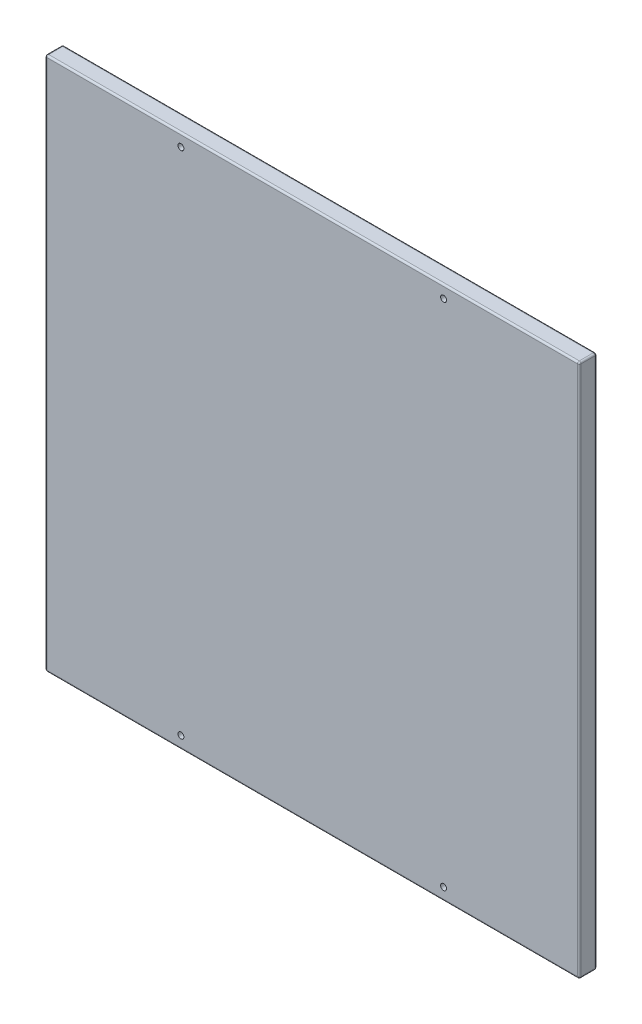
ISO-10303-21;
HEADER;
FILE_DESCRIPTION(('STEP AP214'),'2;1');
FILE_NAME('part.step','',(''),(''),'','','');
FILE_SCHEMA(('AUTOMOTIVE_DESIGN { 1 0 10303 214 1 1 1 1 }'));
ENDSEC;
DATA;
#1=APPLICATION_CONTEXT('core data for automotive mechanical design processes');
#2=APPLICATION_PROTOCOL_DEFINITION('international standard','automotive_design',2000,#1);
#3=PRODUCT_CONTEXT('',#1,'mechanical');
#4=PRODUCT('Part','Part','',(#3));
#5=PRODUCT_RELATED_PRODUCT_CATEGORY('part','',(#4));
#6=PRODUCT_DEFINITION_FORMATION('','',#4);
#7=PRODUCT_DEFINITION_CONTEXT('part definition',#1,'design');
#8=PRODUCT_DEFINITION('design','',#6,#7);
#9=PRODUCT_DEFINITION_SHAPE('','',#8);
#10=(LENGTH_UNIT() NAMED_UNIT(*) SI_UNIT(.MILLI.,.METRE.));
#11=(NAMED_UNIT(*) PLANE_ANGLE_UNIT() SI_UNIT($,.RADIAN.));
#12=(NAMED_UNIT(*) SI_UNIT($,.STERADIAN.) SOLID_ANGLE_UNIT());
#13=UNCERTAINTY_MEASURE_WITH_UNIT(LENGTH_MEASURE(1.E-05),#10,'distance_accuracy_value','');
#14=(GEOMETRIC_REPRESENTATION_CONTEXT(3) GLOBAL_UNCERTAINTY_ASSIGNED_CONTEXT((#13)) GLOBAL_UNIT_ASSIGNED_CONTEXT((#10,
#11,#12)) REPRESENTATION_CONTEXT('',''));
#15=CARTESIAN_POINT('',(0.,0.,0.));
#16=DIRECTION('',(0.,0.,1.));
#17=DIRECTION('',(1.,0.,0.));
#18=AXIS2_PLACEMENT_3D('',#15,#16,#17);
#19=CARTESIAN_POINT('',(152.5,-152.5,10.));
#20=DIRECTION('',(-1.,0.,0.));
#21=DIRECTION('',(0.,0.,1.));
#22=AXIS2_PLACEMENT_3D('',#19,#20,#21);
#23=PLANE('',#22);
#24=DIRECTION('',(0.,0.,-1.));
#25=VECTOR('',#24,1.);
#26=CARTESIAN_POINT('',(152.5,-151.5,10.));
#27=LINE('',#26,#25);
#28=CARTESIAN_POINT('',(152.5,-151.5,9.));
#29=VERTEX_POINT('',#28);
#30=CARTESIAN_POINT('',(152.5,-151.5,0.999999999999999));
#31=VERTEX_POINT('',#30);
#32=EDGE_CURVE('E187',#29,#31,#27,.T.);
#33=ORIENTED_EDGE('',*,*,#32,.T.);
#34=DIRECTION('',(0.,1.,0.));
#35=VECTOR('',#34,1.);
#36=CARTESIAN_POINT('',(152.5,152.5,0.999999999999999));
#37=LINE('',#36,#35);
#38=CARTESIAN_POINT('',(152.5,151.5,0.999999999999999));
#39=VERTEX_POINT('',#38);
#40=EDGE_CURVE('E190',#31,#39,#37,.T.);
#41=ORIENTED_EDGE('',*,*,#40,.T.);
#42=DIRECTION('',(0.,0.,-1.));
#43=VECTOR('',#42,1.);
#44=CARTESIAN_POINT('',(152.5,151.5,10.));
#45=LINE('',#44,#43);
#46=CARTESIAN_POINT('',(152.5,151.5,9.));
#47=VERTEX_POINT('',#46);
#48=EDGE_CURVE('E185',#39,#47,#45,.F.);
#49=ORIENTED_EDGE('',*,*,#48,.T.);
#50=DIRECTION('',(0.,1.,0.));
#51=VECTOR('',#50,1.);
#52=CARTESIAN_POINT('',(152.5,-152.5,9.));
#53=LINE('',#52,#51);
#54=EDGE_CURVE('E183',#47,#29,#53,.F.);
#55=ORIENTED_EDGE('',*,*,#54,.T.);
#56=EDGE_LOOP('',(#33,#41,#49,#55));
#57=FACE_BOUND('',#56,.T.);
#58=ADVANCED_FACE('F33',(#57),#23,.F.);
#59=CARTESIAN_POINT('',(-152.5,152.5,10.));
#60=DIRECTION('',(0.,-1.,0.));
#61=DIRECTION('',(0.,0.,-1.));
#62=AXIS2_PLACEMENT_3D('',#59,#60,#61);
#63=PLANE('',#62);
#64=DIRECTION('',(0.,0.,-1.));
#65=VECTOR('',#64,1.);
#66=CARTESIAN_POINT('',(151.5,152.5,10.));
#67=LINE('',#66,#65);
#68=CARTESIAN_POINT('',(151.5,152.5,9.));
#69=VERTEX_POINT('',#68);
#70=CARTESIAN_POINT('',(151.5,152.5,0.999999999999999));
#71=VERTEX_POINT('',#70);
#72=EDGE_CURVE('E169',#69,#71,#67,.T.);
#73=ORIENTED_EDGE('',*,*,#72,.T.);
#74=DIRECTION('',(-1.,0.,0.));
#75=VECTOR('',#74,1.);
#76=CARTESIAN_POINT('',(-152.5,152.5,0.999999999999999));
#77=LINE('',#76,#75);
#78=CARTESIAN_POINT('',(-151.5,152.5,0.999999999999999));
#79=VERTEX_POINT('',#78);
#80=EDGE_CURVE('E174',#71,#79,#77,.T.);
#81=ORIENTED_EDGE('',*,*,#80,.T.);
#82=DIRECTION('',(0.,0.,-1.));
#83=VECTOR('',#82,1.);
#84=CARTESIAN_POINT('',(-151.5,152.5,10.));
#85=LINE('',#84,#83);
#86=CARTESIAN_POINT('',(-151.5,152.5,9.));
#87=VERTEX_POINT('',#86);
#88=EDGE_CURVE('E171',#79,#87,#85,.F.);
#89=ORIENTED_EDGE('',*,*,#88,.T.);
#90=DIRECTION('',(-1.,0.,0.));
#91=VECTOR('',#90,1.);
#92=CARTESIAN_POINT('',(-152.5,152.5,9.));
#93=LINE('',#92,#91);
#94=EDGE_CURVE('E167',#87,#69,#93,.F.);
#95=ORIENTED_EDGE('',*,*,#94,.T.);
#96=EDGE_LOOP('',(#73,#81,#89,#95));
#97=FACE_BOUND('',#96,.T.);
#98=ADVANCED_FACE('F310',(#97),#63,.F.);
#99=CARTESIAN_POINT('',(-152.5,-152.5,10.));
#100=DIRECTION('',(1.,0.,0.));
#101=DIRECTION('',(0.,0.,-1.));
#102=AXIS2_PLACEMENT_3D('',#99,#100,#101);
#103=PLANE('',#102);
#104=DIRECTION('',(0.,0.,-1.));
#105=VECTOR('',#104,1.);
#106=CARTESIAN_POINT('',(-152.5,151.5,10.));
#107=LINE('',#106,#105);
#108=CARTESIAN_POINT('',(-152.5,151.5,9.));
#109=VERTEX_POINT('',#108);
#110=CARTESIAN_POINT('',(-152.5,151.5,0.999999999999999));
#111=VERTEX_POINT('',#110);
#112=EDGE_CURVE('E132',#109,#111,#107,.T.);
#113=ORIENTED_EDGE('',*,*,#112,.T.);
#114=DIRECTION('',(0.,-1.,0.));
#115=VECTOR('',#114,1.);
#116=CARTESIAN_POINT('',(-152.5,-152.5,0.999999999999999));
#117=LINE('',#116,#115);
#118=CARTESIAN_POINT('',(-152.5,-151.5,0.999999999999999));
#119=VERTEX_POINT('',#118);
#120=EDGE_CURVE('E128',#111,#119,#117,.T.);
#121=ORIENTED_EDGE('',*,*,#120,.T.);
#122=DIRECTION('',(0.,0.,-1.));
#123=VECTOR('',#122,1.);
#124=CARTESIAN_POINT('',(-152.5,-151.5,10.));
#125=LINE('',#124,#123);
#126=CARTESIAN_POINT('',(-152.5,-151.5,9.));
#127=VERTEX_POINT('',#126);
#128=EDGE_CURVE('E120',#119,#127,#125,.F.);
#129=ORIENTED_EDGE('',*,*,#128,.T.);
#130=DIRECTION('',(0.,-1.,0.));
#131=VECTOR('',#130,1.);
#132=CARTESIAN_POINT('',(-152.5,-152.5,9.));
#133=LINE('',#132,#131);
#134=EDGE_CURVE('E125',#127,#109,#133,.F.);
#135=ORIENTED_EDGE('',*,*,#134,.T.);
#136=EDGE_LOOP('',(#113,#121,#129,#135));
#137=FACE_BOUND('',#136,.T.);
#138=ADVANCED_FACE('F123',(#137),#103,.F.);
#139=CARTESIAN_POINT('',(-152.5,-152.5,10.));
#140=DIRECTION('',(0.,1.,0.));
#141=DIRECTION('',(0.,0.,1.));
#142=AXIS2_PLACEMENT_3D('',#139,#140,#141);
#143=PLANE('',#142);
#144=DIRECTION('',(0.,0.,-1.));
#145=VECTOR('',#144,1.);
#146=CARTESIAN_POINT('',(-151.5,-152.5,10.));
#147=LINE('',#146,#145);
#148=CARTESIAN_POINT('',(-151.5,-152.5,9.));
#149=VERTEX_POINT('',#148);
#150=CARTESIAN_POINT('',(-151.5,-152.5,0.999999999999999));
#151=VERTEX_POINT('',#150);
#152=EDGE_CURVE('E140',#149,#151,#147,.T.);
#153=ORIENTED_EDGE('',*,*,#152,.T.);
#154=DIRECTION('',(1.,0.,0.));
#155=VECTOR('',#154,1.);
#156=CARTESIAN_POINT('',(152.5,-152.5,0.999999999999999));
#157=LINE('',#156,#155);
#158=CARTESIAN_POINT('',(151.5,-152.5,0.999999999999999));
#159=VERTEX_POINT('',#158);
#160=EDGE_CURVE('E181',#151,#159,#157,.T.);
#161=ORIENTED_EDGE('',*,*,#160,.T.);
#162=DIRECTION('',(0.,0.,-1.));
#163=VECTOR('',#162,1.);
#164=CARTESIAN_POINT('',(151.5,-152.5,10.));
#165=LINE('',#164,#163);
#166=CARTESIAN_POINT('',(151.5,-152.5,9.));
#167=VERTEX_POINT('',#166);
#168=EDGE_CURVE('E178',#159,#167,#165,.F.);
#169=ORIENTED_EDGE('',*,*,#168,.T.);
#170=DIRECTION('',(1.,0.,0.));
#171=VECTOR('',#170,1.);
#172=CARTESIAN_POINT('',(-152.5,-152.5,9.));
#173=LINE('',#172,#171);
#174=EDGE_CURVE('E176',#167,#149,#173,.F.);
#175=ORIENTED_EDGE('',*,*,#174,.T.);
#176=EDGE_LOOP('',(#153,#161,#169,#175));
#177=FACE_BOUND('',#176,.T.);
#178=ADVANCED_FACE('F300',(#177),#143,.F.);
#179=CARTESIAN_POINT('',(0.,0.,10.));
#180=DIRECTION('',(0.,0.,-1.));
#181=DIRECTION('',(-1.,0.,0.));
#182=AXIS2_PLACEMENT_3D('',#179,#180,#181);
#183=PLANE('',#182);
#184=CARTESIAN_POINT('',(-75.,-145.5,10.));
#185=DIRECTION('',(0.,0.,1.));
#186=DIRECTION('',(1.,0.,0.));
#187=AXIS2_PLACEMENT_3D('',#184,#185,#186);
#188=CIRCLE('',#187,1.70000000000001);
#189=CARTESIAN_POINT('',(-73.3,-145.5,10.));
#190=VERTEX_POINT('',#189);
#191=EDGE_CURVE('E421',#190,#190,#188,.T.);
#192=ORIENTED_EDGE('',*,*,#191,.F.);
#193=EDGE_LOOP('',(#192));
#194=FACE_BOUND('',#193,.T.);
#195=CARTESIAN_POINT('',(75.,-145.5,10.));
#196=DIRECTION('',(0.,0.,1.));
#197=DIRECTION('',(1.,0.,0.));
#198=AXIS2_PLACEMENT_3D('',#195,#196,#197);
#199=CIRCLE('',#198,1.70000000000001);
#200=CARTESIAN_POINT('',(76.7,-145.5,10.));
#201=VERTEX_POINT('',#200);
#202=EDGE_CURVE('E414',#201,#201,#199,.T.);
#203=ORIENTED_EDGE('',*,*,#202,.F.);
#204=EDGE_LOOP('',(#203));
#205=FACE_BOUND('',#204,.T.);
#206=CARTESIAN_POINT('',(75.,145.5,10.));
#207=DIRECTION('',(0.,0.,1.));
#208=DIRECTION('',(1.,0.,0.));
#209=AXIS2_PLACEMENT_3D('',#206,#207,#208);
#210=CIRCLE('',#209,1.70000000000001);
#211=CARTESIAN_POINT('',(76.7,145.5,10.));
#212=VERTEX_POINT('',#211);
#213=EDGE_CURVE('E408',#212,#212,#210,.T.);
#214=ORIENTED_EDGE('',*,*,#213,.F.);
#215=EDGE_LOOP('',(#214));
#216=FACE_BOUND('',#215,.T.);
#217=CARTESIAN_POINT('',(-75.,145.5,10.));
#218=DIRECTION('',(0.,0.,1.));
#219=DIRECTION('',(1.,0.,0.));
#220=AXIS2_PLACEMENT_3D('',#217,#218,#219);
#221=CIRCLE('',#220,1.70000000000001);
#222=CARTESIAN_POINT('',(-73.3,145.5,10.));
#223=VERTEX_POINT('',#222);
#224=EDGE_CURVE('E162',#223,#223,#221,.T.);
#225=ORIENTED_EDGE('',*,*,#224,.F.);
#226=EDGE_LOOP('',(#225));
#227=FACE_BOUND('',#226,.T.);
#228=DIRECTION('',(0.,-1.,0.));
#229=VECTOR('',#228,1.);
#230=CARTESIAN_POINT('',(-151.5,0.,10.));
#231=LINE('',#230,#229);
#232=CARTESIAN_POINT('',(-151.5,151.5,10.));
#233=VERTEX_POINT('',#232);
#234=CARTESIAN_POINT('',(-151.5,-151.5,10.));
#235=VERTEX_POINT('',#234);
#236=EDGE_CURVE('E42',#233,#235,#231,.T.);
#237=ORIENTED_EDGE('',*,*,#236,.T.);
#238=DIRECTION('',(1.,0.,0.));
#239=VECTOR('',#238,1.);
#240=CARTESIAN_POINT('',(0.,-151.5,10.));
#241=LINE('',#240,#239);
#242=CARTESIAN_POINT('',(151.5,-151.5,10.));
#243=VERTEX_POINT('',#242);
#244=EDGE_CURVE('E11',#235,#243,#241,.T.);
#245=ORIENTED_EDGE('',*,*,#244,.T.);
#246=DIRECTION('',(0.,1.,0.));
#247=VECTOR('',#246,1.);
#248=CARTESIAN_POINT('',(151.5,0.,10.));
#249=LINE('',#248,#247);
#250=CARTESIAN_POINT('',(151.5,151.5,10.));
#251=VERTEX_POINT('',#250);
#252=EDGE_CURVE('E201',#243,#251,#249,.T.);
#253=ORIENTED_EDGE('',*,*,#252,.T.);
#254=DIRECTION('',(-1.,0.,0.));
#255=VECTOR('',#254,1.);
#256=CARTESIAN_POINT('',(0.,151.5,10.));
#257=LINE('',#256,#255);
#258=EDGE_CURVE('E53',#251,#233,#257,.T.);
#259=ORIENTED_EDGE('',*,*,#258,.T.);
#260=EDGE_LOOP('',(#237,#245,#253,#259));
#261=FACE_BOUND('',#260,.T.);
#262=ADVANCED_FACE('F302',(#194,#205,#216,#227,#261),#183,.F.);
#263=CARTESIAN_POINT('',(0.,0.,0.));
#264=DIRECTION('',(0.,0.,-1.));
#265=DIRECTION('',(-1.,0.,0.));
#266=AXIS2_PLACEMENT_3D('',#263,#264,#265);
#267=PLANE('',#266);
#268=CARTESIAN_POINT('',(-75.,-145.5,0.));
#269=DIRECTION('',(0.,0.,1.));
#270=DIRECTION('',(1.,0.,0.));
#271=AXIS2_PLACEMENT_3D('',#268,#269,#270);
#272=CIRCLE('',#271,1.70000000000001);
#273=CARTESIAN_POINT('',(-73.3,-145.5,0.));
#274=VERTEX_POINT('',#273);
#275=EDGE_CURVE('E419',#274,#274,#272,.T.);
#276=ORIENTED_EDGE('',*,*,#275,.T.);
#277=EDGE_LOOP('',(#276));
#278=FACE_BOUND('',#277,.T.);
#279=CARTESIAN_POINT('',(75.,-145.5,0.));
#280=DIRECTION('',(0.,0.,1.));
#281=DIRECTION('',(1.,0.,0.));
#282=AXIS2_PLACEMENT_3D('',#279,#280,#281);
#283=CIRCLE('',#282,1.70000000000001);
#284=CARTESIAN_POINT('',(76.7,-145.5,0.));
#285=VERTEX_POINT('',#284);
#286=EDGE_CURVE('E410',#285,#285,#283,.T.);
#287=ORIENTED_EDGE('',*,*,#286,.T.);
#288=EDGE_LOOP('',(#287));
#289=FACE_BOUND('',#288,.T.);
#290=CARTESIAN_POINT('',(75.,145.5,0.));
#291=DIRECTION('',(0.,0.,1.));
#292=DIRECTION('',(1.,0.,0.));
#293=AXIS2_PLACEMENT_3D('',#290,#291,#292);
#294=CIRCLE('',#293,1.70000000000001);
#295=CARTESIAN_POINT('',(76.7,145.5,0.));
#296=VERTEX_POINT('',#295);
#297=EDGE_CURVE('E405',#296,#296,#294,.T.);
#298=ORIENTED_EDGE('',*,*,#297,.T.);
#299=EDGE_LOOP('',(#298));
#300=FACE_BOUND('',#299,.T.);
#301=CARTESIAN_POINT('',(-75.,145.5,0.));
#302=DIRECTION('',(0.,0.,1.));
#303=DIRECTION('',(1.,0.,0.));
#304=AXIS2_PLACEMENT_3D('',#301,#302,#303);
#305=CIRCLE('',#304,1.70000000000001);
#306=CARTESIAN_POINT('',(-73.3,145.5,0.));
#307=VERTEX_POINT('',#306);
#308=EDGE_CURVE('E208',#307,#307,#305,.T.);
#309=ORIENTED_EDGE('',*,*,#308,.T.);
#310=EDGE_LOOP('',(#309));
#311=FACE_BOUND('',#310,.T.);
#312=DIRECTION('',(0.,-1.,0.));
#313=VECTOR('',#312,1.);
#314=CARTESIAN_POINT('',(-151.5,152.5,0.));
#315=LINE('',#314,#313);
#316=CARTESIAN_POINT('',(-151.5,-151.5,0.));
#317=VERTEX_POINT('',#316);
#318=CARTESIAN_POINT('',(-151.5,151.5,0.));
#319=VERTEX_POINT('',#318);
#320=EDGE_CURVE('E196',#317,#319,#315,.F.);
#321=ORIENTED_EDGE('',*,*,#320,.T.);
#322=DIRECTION('',(-1.,0.,0.));
#323=VECTOR('',#322,1.);
#324=CARTESIAN_POINT('',(152.5,151.5,0.));
#325=LINE('',#324,#323);
#326=CARTESIAN_POINT('',(151.5,151.5,0.));
#327=VERTEX_POINT('',#326);
#328=EDGE_CURVE('E198',#319,#327,#325,.F.);
#329=ORIENTED_EDGE('',*,*,#328,.T.);
#330=DIRECTION('',(0.,1.,0.));
#331=VECTOR('',#330,1.);
#332=CARTESIAN_POINT('',(151.5,-152.5,0.));
#333=LINE('',#332,#331);
#334=CARTESIAN_POINT('',(151.5,-151.5,0.));
#335=VERTEX_POINT('',#334);
#336=EDGE_CURVE('E192',#327,#335,#333,.F.);
#337=ORIENTED_EDGE('',*,*,#336,.T.);
#338=DIRECTION('',(1.,0.,0.));
#339=VECTOR('',#338,1.);
#340=CARTESIAN_POINT('',(-152.5,-151.5,0.));
#341=LINE('',#340,#339);
#342=EDGE_CURVE('E194',#335,#317,#341,.F.);
#343=ORIENTED_EDGE('',*,*,#342,.T.);
#344=EDGE_LOOP('',(#321,#329,#337,#343));
#345=FACE_BOUND('',#344,.T.);
#346=ADVANCED_FACE('F269',(#278,#289,#300,#311,#345),#267,.T.);
#347=CARTESIAN_POINT('',(151.5,-151.5,10.));
#348=DIRECTION('',(0.,0.,-1.));
#349=DIRECTION('',(-1.,0.,0.));
#350=AXIS2_PLACEMENT_3D('',#347,#348,#349);
#351=CYLINDRICAL_SURFACE('',#350,1.);
#352=CARTESIAN_POINT('',(151.5,-151.5,9.));
#353=DIRECTION('',(0.,0.,1.));
#354=DIRECTION('',(1.,0.,0.));
#355=AXIS2_PLACEMENT_3D('',#352,#353,#354);
#356=CIRCLE('',#355,1.);
#357=EDGE_CURVE('E37',#167,#29,#356,.T.);
#358=ORIENTED_EDGE('',*,*,#357,.F.);
#359=ORIENTED_EDGE('',*,*,#168,.F.);
#360=CARTESIAN_POINT('',(151.5,-151.5,0.999999999999999));
#361=DIRECTION('',(0.,0.,-1.));
#362=DIRECTION('',(-1.,0.,0.));
#363=AXIS2_PLACEMENT_3D('',#360,#361,#362);
#364=CIRCLE('',#363,1.);
#365=EDGE_CURVE('E160',#31,#159,#364,.T.);
#366=ORIENTED_EDGE('',*,*,#365,.F.);
#367=ORIENTED_EDGE('',*,*,#32,.F.);
#368=EDGE_LOOP('',(#358,#359,#366,#367));
#369=FACE_BOUND('',#368,.T.);
#370=ADVANCED_FACE('F35',(#369),#351,.T.);
#371=CARTESIAN_POINT('',(151.5,-151.5,9.));
#372=DIRECTION('',(0.,0.,1.));
#373=DIRECTION('',(1.,0.,0.));
#374=AXIS2_PLACEMENT_3D('',#371,#372,#373);
#375=SPHERICAL_SURFACE('',#374,1.);
#376=CARTESIAN_POINT('',(151.5,-151.5,9.));
#377=DIRECTION('',(1.,0.,0.));
#378=DIRECTION('',(0.,0.,-1.));
#379=AXIS2_PLACEMENT_3D('',#376,#377,#378);
#380=CIRCLE('',#379,1.);
#381=EDGE_CURVE('E248',#167,#243,#380,.F.);
#382=ORIENTED_EDGE('',*,*,#381,.F.);
#383=ORIENTED_EDGE('',*,*,#357,.T.);
#384=CARTESIAN_POINT('',(151.5,-151.5,9.));
#385=DIRECTION('',(0.,-1.,0.));
#386=DIRECTION('',(0.,0.,-1.));
#387=AXIS2_PLACEMENT_3D('',#384,#385,#386);
#388=CIRCLE('',#387,1.);
#389=EDGE_CURVE('E251',#243,#29,#388,.F.);
#390=ORIENTED_EDGE('',*,*,#389,.F.);
#391=EDGE_LOOP('',(#382,#383,#390));
#392=FACE_BOUND('',#391,.T.);
#393=ADVANCED_FACE('F295',(#392),#375,.T.);
#394=CARTESIAN_POINT('',(151.5,-151.5,1.));
#395=DIRECTION('',(0.,0.,1.));
#396=DIRECTION('',(1.,0.,0.));
#397=AXIS2_PLACEMENT_3D('',#394,#395,#396);
#398=SPHERICAL_SURFACE('',#397,1.);
#399=CARTESIAN_POINT('',(151.5,-151.5,1.));
#400=DIRECTION('',(0.,-1.,0.));
#401=DIRECTION('',(0.,0.,-1.));
#402=AXIS2_PLACEMENT_3D('',#399,#400,#401);
#403=CIRCLE('',#402,1.);
#404=EDGE_CURVE('E242',#31,#335,#403,.F.);
#405=ORIENTED_EDGE('',*,*,#404,.F.);
#406=ORIENTED_EDGE('',*,*,#365,.T.);
#407=CARTESIAN_POINT('',(151.5,-151.5,0.999999999999999));
#408=DIRECTION('',(1.,0.,0.));
#409=DIRECTION('',(0.,0.,-1.));
#410=AXIS2_PLACEMENT_3D('',#407,#408,#409);
#411=CIRCLE('',#410,1.);
#412=EDGE_CURVE('E245',#335,#159,#411,.F.);
#413=ORIENTED_EDGE('',*,*,#412,.F.);
#414=EDGE_LOOP('',(#405,#406,#413));
#415=FACE_BOUND('',#414,.T.);
#416=ADVANCED_FACE('F258',(#415),#398,.T.);
#417=CARTESIAN_POINT('',(151.5,0.,9.));
#418=DIRECTION('',(0.,1.,0.));
#419=DIRECTION('',(0.,0.,1.));
#420=AXIS2_PLACEMENT_3D('',#417,#418,#419);
#421=CYLINDRICAL_SURFACE('',#420,1.);
#422=ORIENTED_EDGE('',*,*,#389,.T.);
#423=ORIENTED_EDGE('',*,*,#54,.F.);
#424=CARTESIAN_POINT('',(151.5,151.5,9.));
#425=DIRECTION('',(0.,1.,0.));
#426=DIRECTION('',(0.,0.,1.));
#427=AXIS2_PLACEMENT_3D('',#424,#425,#426);
#428=CIRCLE('',#427,1.);
#429=EDGE_CURVE('E236',#251,#47,#428,.T.);
#430=ORIENTED_EDGE('',*,*,#429,.F.);
#431=ORIENTED_EDGE('',*,*,#252,.F.);
#432=EDGE_LOOP('',(#422,#423,#430,#431));
#433=FACE_BOUND('',#432,.T.);
#434=ADVANCED_FACE('F290',(#433),#421,.T.);
#435=CARTESIAN_POINT('',(0.,-151.5,9.));
#436=DIRECTION('',(1.,0.,0.));
#437=DIRECTION('',(0.,0.,-1.));
#438=AXIS2_PLACEMENT_3D('',#435,#436,#437);
#439=CYLINDRICAL_SURFACE('',#438,1.);
#440=ORIENTED_EDGE('',*,*,#381,.T.);
#441=ORIENTED_EDGE('',*,*,#244,.F.);
#442=CARTESIAN_POINT('',(-151.5,-151.5,9.));
#443=DIRECTION('',(-1.,0.,0.));
#444=DIRECTION('',(0.,0.,1.));
#445=AXIS2_PLACEMENT_3D('',#442,#443,#444);
#446=CIRCLE('',#445,1.);
#447=EDGE_CURVE('E144',#149,#235,#446,.T.);
#448=ORIENTED_EDGE('',*,*,#447,.F.);
#449=ORIENTED_EDGE('',*,*,#174,.F.);
#450=EDGE_LOOP('',(#440,#441,#448,#449));
#451=FACE_BOUND('',#450,.T.);
#452=ADVANCED_FACE('F298',(#451),#439,.T.);
#453=CARTESIAN_POINT('',(-151.5,-151.5,10.));
#454=DIRECTION('',(0.,0.,-1.));
#455=DIRECTION('',(-1.,0.,0.));
#456=AXIS2_PLACEMENT_3D('',#453,#454,#455);
#457=CYLINDRICAL_SURFACE('',#456,1.);
#458=CARTESIAN_POINT('',(-151.5,-151.5,0.999999999999999));
#459=DIRECTION('',(0.,0.,-1.));
#460=DIRECTION('',(-1.,0.,0.));
#461=AXIS2_PLACEMENT_3D('',#458,#459,#460);
#462=CIRCLE('',#461,1.);
#463=EDGE_CURVE('E145',#151,#119,#462,.T.);
#464=ORIENTED_EDGE('',*,*,#463,.F.);
#465=ORIENTED_EDGE('',*,*,#152,.F.);
#466=CARTESIAN_POINT('',(-151.5,-151.5,9.));
#467=DIRECTION('',(0.,0.,1.));
#468=DIRECTION('',(1.,0.,0.));
#469=AXIS2_PLACEMENT_3D('',#466,#467,#468);
#470=CIRCLE('',#469,1.);
#471=EDGE_CURVE('E136',#127,#149,#470,.T.);
#472=ORIENTED_EDGE('',*,*,#471,.F.);
#473=ORIENTED_EDGE('',*,*,#128,.F.);
#474=EDGE_LOOP('',(#464,#465,#472,#473));
#475=FACE_BOUND('',#474,.T.);
#476=ADVANCED_FACE('F138',(#475),#457,.T.);
#477=CARTESIAN_POINT('',(-152.5,-151.5,0.999999999999999));
#478=DIRECTION('',(-1.,0.,0.));
#479=DIRECTION('',(0.,0.,1.));
#480=AXIS2_PLACEMENT_3D('',#477,#478,#479);
#481=CYLINDRICAL_SURFACE('',#480,1.);
#482=ORIENTED_EDGE('',*,*,#412,.T.);
#483=ORIENTED_EDGE('',*,*,#160,.F.);
#484=CARTESIAN_POINT('',(-151.5,-151.5,1.));
#485=DIRECTION('',(-1.,0.,0.));
#486=DIRECTION('',(0.,0.,1.));
#487=AXIS2_PLACEMENT_3D('',#484,#485,#486);
#488=CIRCLE('',#487,1.);
#489=EDGE_CURVE('E232',#317,#151,#488,.T.);
#490=ORIENTED_EDGE('',*,*,#489,.F.);
#491=ORIENTED_EDGE('',*,*,#342,.F.);
#492=EDGE_LOOP('',(#482,#483,#490,#491));
#493=FACE_BOUND('',#492,.T.);
#494=ADVANCED_FACE('F265',(#493),#481,.T.);
#495=CARTESIAN_POINT('',(151.5,-152.5,0.999999999999999));
#496=DIRECTION('',(0.,-1.,0.));
#497=DIRECTION('',(0.,0.,-1.));
#498=AXIS2_PLACEMENT_3D('',#495,#496,#497);
#499=CYLINDRICAL_SURFACE('',#498,1.);
#500=ORIENTED_EDGE('',*,*,#404,.T.);
#501=ORIENTED_EDGE('',*,*,#336,.F.);
#502=CARTESIAN_POINT('',(151.5,151.5,0.999999999999999));
#503=DIRECTION('',(0.,1.,0.));
#504=DIRECTION('',(0.,0.,1.));
#505=AXIS2_PLACEMENT_3D('',#502,#503,#504);
#506=CIRCLE('',#505,1.);
#507=EDGE_CURVE('E229',#39,#327,#506,.T.);
#508=ORIENTED_EDGE('',*,*,#507,.F.);
#509=ORIENTED_EDGE('',*,*,#40,.F.);
#510=EDGE_LOOP('',(#500,#501,#508,#509));
#511=FACE_BOUND('',#510,.T.);
#512=ADVANCED_FACE('F275',(#511),#499,.T.);
#513=CARTESIAN_POINT('',(151.5,151.5,10.));
#514=DIRECTION('',(0.,0.,-1.));
#515=DIRECTION('',(-1.,0.,0.));
#516=AXIS2_PLACEMENT_3D('',#513,#514,#515);
#517=CYLINDRICAL_SURFACE('',#516,1.);
#518=CARTESIAN_POINT('',(151.5,151.5,9.));
#519=DIRECTION('',(0.,0.,1.));
#520=DIRECTION('',(1.,0.,0.));
#521=AXIS2_PLACEMENT_3D('',#518,#519,#520);
#522=CIRCLE('',#521,1.);
#523=EDGE_CURVE('E239',#47,#69,#522,.T.);
#524=ORIENTED_EDGE('',*,*,#523,.F.);
#525=ORIENTED_EDGE('',*,*,#48,.F.);
#526=CARTESIAN_POINT('',(151.5,151.5,0.999999999999999));
#527=DIRECTION('',(0.,0.,-1.));
#528=DIRECTION('',(-1.,0.,0.));
#529=AXIS2_PLACEMENT_3D('',#526,#527,#528);
#530=CIRCLE('',#529,1.);
#531=EDGE_CURVE('E226',#71,#39,#530,.T.);
#532=ORIENTED_EDGE('',*,*,#531,.F.);
#533=ORIENTED_EDGE('',*,*,#72,.F.);
#534=EDGE_LOOP('',(#524,#525,#532,#533));
#535=FACE_BOUND('',#534,.T.);
#536=ADVANCED_FACE('F282',(#535),#517,.T.);
#537=CARTESIAN_POINT('',(151.5,151.5,9.));
#538=DIRECTION('',(0.,0.,1.));
#539=DIRECTION('',(1.,0.,0.));
#540=AXIS2_PLACEMENT_3D('',#537,#538,#539);
#541=SPHERICAL_SURFACE('',#540,1.);
#542=ORIENTED_EDGE('',*,*,#429,.T.);
#543=ORIENTED_EDGE('',*,*,#523,.T.);
#544=CARTESIAN_POINT('',(151.5,151.5,9.));
#545=DIRECTION('',(1.,0.,0.));
#546=DIRECTION('',(0.,0.,-1.));
#547=AXIS2_PLACEMENT_3D('',#544,#545,#546);
#548=CIRCLE('',#547,1.);
#549=EDGE_CURVE('E151',#251,#69,#548,.F.);
#550=ORIENTED_EDGE('',*,*,#549,.F.);
#551=EDGE_LOOP('',(#542,#543,#550));
#552=FACE_BOUND('',#551,.T.);
#553=ADVANCED_FACE('F288',(#552),#541,.T.);
#554=CARTESIAN_POINT('',(-151.5,-151.5,9.));
#555=DIRECTION('',(0.,0.,1.));
#556=DIRECTION('',(1.,0.,0.));
#557=AXIS2_PLACEMENT_3D('',#554,#555,#556);
#558=SPHERICAL_SURFACE('',#557,1.);
#559=ORIENTED_EDGE('',*,*,#471,.T.);
#560=ORIENTED_EDGE('',*,*,#447,.T.);
#561=CARTESIAN_POINT('',(-151.5,-151.5,9.));
#562=DIRECTION('',(0.,-1.,0.));
#563=DIRECTION('',(0.,0.,-1.));
#564=AXIS2_PLACEMENT_3D('',#561,#562,#563);
#565=CIRCLE('',#564,1.);
#566=EDGE_CURVE('E148',#127,#235,#565,.F.);
#567=ORIENTED_EDGE('',*,*,#566,.F.);
#568=EDGE_LOOP('',(#559,#560,#567));
#569=FACE_BOUND('',#568,.T.);
#570=ADVANCED_FACE('F149',(#569),#558,.T.);
#571=CARTESIAN_POINT('',(-151.5,-151.5,1.));
#572=DIRECTION('',(0.,0.,1.));
#573=DIRECTION('',(1.,0.,0.));
#574=AXIS2_PLACEMENT_3D('',#571,#572,#573);
#575=SPHERICAL_SURFACE('',#574,1.);
#576=ORIENTED_EDGE('',*,*,#489,.T.);
#577=ORIENTED_EDGE('',*,*,#463,.T.);
#578=CARTESIAN_POINT('',(-151.5,-151.5,0.999999999999999));
#579=DIRECTION('',(0.,-1.,0.));
#580=DIRECTION('',(0.,0.,-1.));
#581=AXIS2_PLACEMENT_3D('',#578,#579,#580);
#582=CIRCLE('',#581,1.);
#583=EDGE_CURVE('E152',#317,#119,#582,.F.);
#584=ORIENTED_EDGE('',*,*,#583,.F.);
#585=EDGE_LOOP('',(#576,#577,#584));
#586=FACE_BOUND('',#585,.T.);
#587=ADVANCED_FACE('F351',(#586),#575,.T.);
#588=CARTESIAN_POINT('',(151.5,151.5,1.));
#589=DIRECTION('',(0.,0.,1.));
#590=DIRECTION('',(1.,0.,0.));
#591=AXIS2_PLACEMENT_3D('',#588,#589,#590);
#592=SPHERICAL_SURFACE('',#591,1.);
#593=ORIENTED_EDGE('',*,*,#531,.T.);
#594=ORIENTED_EDGE('',*,*,#507,.T.);
#595=CARTESIAN_POINT('',(151.5,151.5,1.));
#596=DIRECTION('',(1.,0.,0.));
#597=DIRECTION('',(0.,0.,-1.));
#598=AXIS2_PLACEMENT_3D('',#595,#596,#597);
#599=CIRCLE('',#598,1.);
#600=EDGE_CURVE('E220',#71,#327,#599,.F.);
#601=ORIENTED_EDGE('',*,*,#600,.F.);
#602=EDGE_LOOP('',(#593,#594,#601));
#603=FACE_BOUND('',#602,.T.);
#604=ADVANCED_FACE('F347',(#603),#592,.T.);
#605=CARTESIAN_POINT('',(0.,151.5,9.));
#606=DIRECTION('',(-1.,0.,0.));
#607=DIRECTION('',(0.,0.,1.));
#608=AXIS2_PLACEMENT_3D('',#605,#606,#607);
#609=CYLINDRICAL_SURFACE('',#608,1.);
#610=ORIENTED_EDGE('',*,*,#549,.T.);
#611=ORIENTED_EDGE('',*,*,#94,.F.);
#612=CARTESIAN_POINT('',(-151.5,151.5,9.));
#613=DIRECTION('',(-1.,0.,0.));
#614=DIRECTION('',(0.,0.,1.));
#615=AXIS2_PLACEMENT_3D('',#612,#613,#614);
#616=CIRCLE('',#615,1.);
#617=EDGE_CURVE('E217',#233,#87,#616,.T.);
#618=ORIENTED_EDGE('',*,*,#617,.F.);
#619=ORIENTED_EDGE('',*,*,#258,.F.);
#620=EDGE_LOOP('',(#610,#611,#618,#619));
#621=FACE_BOUND('',#620,.T.);
#622=ADVANCED_FACE('F344',(#621),#609,.T.);
#623=CARTESIAN_POINT('',(-151.5,0.,9.));
#624=DIRECTION('',(0.,-1.,0.));
#625=DIRECTION('',(0.,0.,-1.));
#626=AXIS2_PLACEMENT_3D('',#623,#624,#625);
#627=CYLINDRICAL_SURFACE('',#626,1.);
#628=ORIENTED_EDGE('',*,*,#566,.T.);
#629=ORIENTED_EDGE('',*,*,#236,.F.);
#630=CARTESIAN_POINT('',(-151.5,151.5,9.));
#631=DIRECTION('',(0.,1.,0.));
#632=DIRECTION('',(0.,0.,1.));
#633=AXIS2_PLACEMENT_3D('',#630,#631,#632);
#634=CIRCLE('',#633,1.);
#635=EDGE_CURVE('E156',#109,#233,#634,.T.);
#636=ORIENTED_EDGE('',*,*,#635,.F.);
#637=ORIENTED_EDGE('',*,*,#134,.F.);
#638=EDGE_LOOP('',(#628,#629,#636,#637));
#639=FACE_BOUND('',#638,.T.);
#640=ADVANCED_FACE('F154',(#639),#627,.T.);
#641=CARTESIAN_POINT('',(-151.5,-152.5,0.999999999999999));
#642=DIRECTION('',(0.,1.,0.));
#643=DIRECTION('',(0.,0.,1.));
#644=AXIS2_PLACEMENT_3D('',#641,#642,#643);
#645=CYLINDRICAL_SURFACE('',#644,1.);
#646=ORIENTED_EDGE('',*,*,#583,.T.);
#647=ORIENTED_EDGE('',*,*,#120,.F.);
#648=CARTESIAN_POINT('',(-151.5,151.5,1.));
#649=DIRECTION('',(0.,1.,0.));
#650=DIRECTION('',(0.,0.,1.));
#651=AXIS2_PLACEMENT_3D('',#648,#649,#650);
#652=CIRCLE('',#651,1.);
#653=EDGE_CURVE('E213',#319,#111,#652,.T.);
#654=ORIENTED_EDGE('',*,*,#653,.F.);
#655=ORIENTED_EDGE('',*,*,#320,.F.);
#656=EDGE_LOOP('',(#646,#647,#654,#655));
#657=FACE_BOUND('',#656,.T.);
#658=ADVANCED_FACE('F337',(#657),#645,.T.);
#659=CARTESIAN_POINT('',(-152.5,151.5,0.999999999999999));
#660=DIRECTION('',(1.,0.,0.));
#661=DIRECTION('',(0.,0.,-1.));
#662=AXIS2_PLACEMENT_3D('',#659,#660,#661);
#663=CYLINDRICAL_SURFACE('',#662,1.);
#664=ORIENTED_EDGE('',*,*,#600,.T.);
#665=ORIENTED_EDGE('',*,*,#328,.F.);
#666=CARTESIAN_POINT('',(-151.5,151.5,0.999999999999999));
#667=DIRECTION('',(-1.,0.,0.));
#668=DIRECTION('',(0.,0.,1.));
#669=AXIS2_PLACEMENT_3D('',#666,#667,#668);
#670=CIRCLE('',#669,1.);
#671=EDGE_CURVE('E210',#79,#319,#670,.T.);
#672=ORIENTED_EDGE('',*,*,#671,.F.);
#673=ORIENTED_EDGE('',*,*,#80,.F.);
#674=EDGE_LOOP('',(#664,#665,#672,#673));
#675=FACE_BOUND('',#674,.T.);
#676=ADVANCED_FACE('F333',(#675),#663,.T.);
#677=CARTESIAN_POINT('',(-151.5,151.5,9.));
#678=DIRECTION('',(0.,0.,1.));
#679=DIRECTION('',(1.,0.,0.));
#680=AXIS2_PLACEMENT_3D('',#677,#678,#679);
#681=SPHERICAL_SURFACE('',#680,1.);
#682=ORIENTED_EDGE('',*,*,#635,.T.);
#683=ORIENTED_EDGE('',*,*,#617,.T.);
#684=CARTESIAN_POINT('',(-151.5,151.5,9.));
#685=DIRECTION('',(0.,0.,1.));
#686=DIRECTION('',(1.,0.,0.));
#687=AXIS2_PLACEMENT_3D('',#684,#685,#686);
#688=CIRCLE('',#687,1.);
#689=EDGE_CURVE('E207',#109,#87,#688,.F.);
#690=ORIENTED_EDGE('',*,*,#689,.F.);
#691=EDGE_LOOP('',(#682,#683,#690));
#692=FACE_BOUND('',#691,.T.);
#693=ADVANCED_FACE('F329',(#692),#681,.T.);
#694=CARTESIAN_POINT('',(-151.5,151.5,1.));
#695=DIRECTION('',(0.,0.,1.));
#696=DIRECTION('',(1.,0.,0.));
#697=AXIS2_PLACEMENT_3D('',#694,#695,#696);
#698=SPHERICAL_SURFACE('',#697,1.);
#699=ORIENTED_EDGE('',*,*,#671,.T.);
#700=ORIENTED_EDGE('',*,*,#653,.T.);
#701=CARTESIAN_POINT('',(-151.5,151.5,0.999999999999999));
#702=DIRECTION('',(0.,0.,-1.));
#703=DIRECTION('',(-1.,0.,0.));
#704=AXIS2_PLACEMENT_3D('',#701,#702,#703);
#705=CIRCLE('',#704,1.);
#706=EDGE_CURVE('E205',#79,#111,#705,.F.);
#707=ORIENTED_EDGE('',*,*,#706,.F.);
#708=EDGE_LOOP('',(#699,#700,#707));
#709=FACE_BOUND('',#708,.T.);
#710=ADVANCED_FACE('F325',(#709),#698,.T.);
#711=CARTESIAN_POINT('',(-151.5,151.5,10.));
#712=DIRECTION('',(0.,0.,-1.));
#713=DIRECTION('',(-1.,0.,0.));
#714=AXIS2_PLACEMENT_3D('',#711,#712,#713);
#715=CYLINDRICAL_SURFACE('',#714,1.);
#716=ORIENTED_EDGE('',*,*,#689,.T.);
#717=ORIENTED_EDGE('',*,*,#88,.F.);
#718=ORIENTED_EDGE('',*,*,#706,.T.);
#719=ORIENTED_EDGE('',*,*,#112,.F.);
#720=EDGE_LOOP('',(#716,#717,#718,#719));
#721=FACE_BOUND('',#720,.T.);
#722=ADVANCED_FACE('F321',(#721),#715,.T.);
#723=CARTESIAN_POINT('',(-75.,145.5,0.));
#724=DIRECTION('',(0.,0.,1.));
#725=DIRECTION('',(1.,0.,0.));
#726=AXIS2_PLACEMENT_3D('',#723,#724,#725);
#727=CYLINDRICAL_SURFACE('',#726,1.70000000000001);
#728=ORIENTED_EDGE('',*,*,#308,.F.);
#729=EDGE_LOOP('',(#728));
#730=FACE_BOUND('',#729,.T.);
#731=ORIENTED_EDGE('',*,*,#224,.T.);
#732=EDGE_LOOP('',(#731));
#733=FACE_BOUND('',#732,.T.);
#734=ADVANCED_FACE('F324',(#730,#733),#727,.F.);
#735=CARTESIAN_POINT('',(75.,145.5,0.));
#736=DIRECTION('',(0.,0.,1.));
#737=DIRECTION('',(1.,0.,0.));
#738=AXIS2_PLACEMENT_3D('',#735,#736,#737);
#739=CYLINDRICAL_SURFACE('',#738,1.70000000000001);
#740=ORIENTED_EDGE('',*,*,#297,.F.);
#741=EDGE_LOOP('',(#740));
#742=FACE_BOUND('',#741,.T.);
#743=ORIENTED_EDGE('',*,*,#213,.T.);
#744=EDGE_LOOP('',(#743));
#745=FACE_BOUND('',#744,.T.);
#746=ADVANCED_FACE('F388',(#742,#745),#739,.F.);
#747=CARTESIAN_POINT('',(75.,-145.5,0.));
#748=DIRECTION('',(0.,0.,1.));
#749=DIRECTION('',(1.,0.,0.));
#750=AXIS2_PLACEMENT_3D('',#747,#748,#749);
#751=CYLINDRICAL_SURFACE('',#750,1.70000000000001);
#752=ORIENTED_EDGE('',*,*,#286,.F.);
#753=EDGE_LOOP('',(#752));
#754=FACE_BOUND('',#753,.T.);
#755=ORIENTED_EDGE('',*,*,#202,.T.);
#756=EDGE_LOOP('',(#755));
#757=FACE_BOUND('',#756,.T.);
#758=ADVANCED_FACE('F393',(#754,#757),#751,.F.);
#759=CARTESIAN_POINT('',(-75.,-145.5,0.));
#760=DIRECTION('',(0.,0.,1.));
#761=DIRECTION('',(1.,0.,0.));
#762=AXIS2_PLACEMENT_3D('',#759,#760,#761);
#763=CYLINDRICAL_SURFACE('',#762,1.70000000000001);
#764=ORIENTED_EDGE('',*,*,#275,.F.);
#765=EDGE_LOOP('',(#764));
#766=FACE_BOUND('',#765,.T.);
#767=ORIENTED_EDGE('',*,*,#191,.T.);
#768=EDGE_LOOP('',(#767));
#769=FACE_BOUND('',#768,.T.);
#770=ADVANCED_FACE('F390',(#766,#769),#763,.F.);
#771=CLOSED_SHELL('',(#58,#98,#138,#178,#262,#346,#370,#393,#416,#434,#452,#476,#494,#512,#536,
#553,#570,#587,#604,#622,#640,#658,#676,#693,#710,#722,#734,#746,#758,#770));
#772=MANIFOLD_SOLID_BREP('B2',#771);
#773=ADVANCED_BREP_SHAPE_REPRESENTATION('',(#18,#772),#14);
#774=SHAPE_DEFINITION_REPRESENTATION(#9,#773);
ENDSEC;
END-ISO-10303-21;
